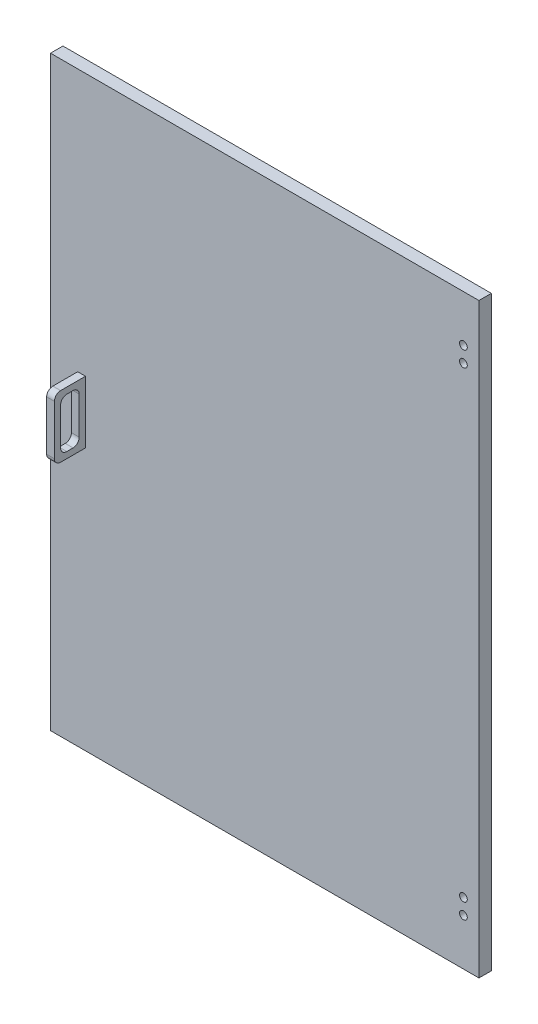
ISO-10303-21;
HEADER;
FILE_DESCRIPTION(('STEP AP214'),'2;1');
FILE_NAME('part.step','',(''),(''),'','','');
FILE_SCHEMA(('AUTOMOTIVE_DESIGN { 1 0 10303 214 1 1 1 1 }'));
ENDSEC;
DATA;
#1=APPLICATION_CONTEXT('core data for automotive mechanical design processes');
#2=APPLICATION_PROTOCOL_DEFINITION('international standard','automotive_design',2000,#1);
#3=PRODUCT_CONTEXT('',#1,'mechanical');
#4=PRODUCT('Part','Part','',(#3));
#5=PRODUCT_RELATED_PRODUCT_CATEGORY('part','',(#4));
#6=PRODUCT_DEFINITION_FORMATION('','',#4);
#7=PRODUCT_DEFINITION_CONTEXT('part definition',#1,'design');
#8=PRODUCT_DEFINITION('design','',#6,#7);
#9=PRODUCT_DEFINITION_SHAPE('','',#8);
#10=(LENGTH_UNIT() NAMED_UNIT(*) SI_UNIT(.MILLI.,.METRE.));
#11=(NAMED_UNIT(*) PLANE_ANGLE_UNIT() SI_UNIT($,.RADIAN.));
#12=(NAMED_UNIT(*) SI_UNIT($,.STERADIAN.) SOLID_ANGLE_UNIT());
#13=UNCERTAINTY_MEASURE_WITH_UNIT(LENGTH_MEASURE(1.E-05),#10,'distance_accuracy_value','');
#14=(GEOMETRIC_REPRESENTATION_CONTEXT(3) GLOBAL_UNCERTAINTY_ASSIGNED_CONTEXT((#13)) GLOBAL_UNIT_ASSIGNED_CONTEXT((#10,
#11,#12)) REPRESENTATION_CONTEXT('',''));
#15=CARTESIAN_POINT('',(0.,0.,0.));
#16=DIRECTION('',(0.,0.,1.));
#17=DIRECTION('',(1.,0.,0.));
#18=AXIS2_PLACEMENT_3D('',#15,#16,#17);
#19=CARTESIAN_POINT('',(0.,0.,0.));
#20=DIRECTION('',(0.,0.,1.));
#21=DIRECTION('',(1.,0.,0.));
#22=AXIS2_PLACEMENT_3D('',#19,#20,#21);
#23=PLANE('',#22);
#24=CARTESIAN_POINT('',(81.28,100.965,0.));
#25=DIRECTION('',(0.,0.,1.));
#26=DIRECTION('',(1.,0.,0.));
#27=AXIS2_PLACEMENT_3D('',#24,#25,#26);
#28=CIRCLE('',#27,1.5875);
#29=CARTESIAN_POINT('',(82.8675,100.965,0.));
#30=VERTEX_POINT('',#29);
#31=EDGE_CURVE('E229',#30,#30,#28,.T.);
#32=ORIENTED_EDGE('',*,*,#31,.F.);
#33=EDGE_LOOP('',(#32));
#34=FACE_BOUND('',#33,.T.);
#35=CARTESIAN_POINT('',(81.28,94.615,0.));
#36=DIRECTION('',(0.,0.,1.));
#37=DIRECTION('',(1.,0.,0.));
#38=AXIS2_PLACEMENT_3D('',#35,#36,#37);
#39=CIRCLE('',#38,1.5875);
#40=CARTESIAN_POINT('',(82.8675,94.615,0.));
#41=VERTEX_POINT('',#40);
#42=EDGE_CURVE('E233',#41,#41,#39,.T.);
#43=ORIENTED_EDGE('',*,*,#42,.F.);
#44=EDGE_LOOP('',(#43));
#45=FACE_BOUND('',#44,.T.);
#46=CARTESIAN_POINT('',(81.28,-94.615,0.));
#47=DIRECTION('',(0.,0.,1.));
#48=DIRECTION('',(-1.,0.,0.));
#49=AXIS2_PLACEMENT_3D('',#46,#47,#48);
#50=CIRCLE('',#49,1.5875);
#51=CARTESIAN_POINT('',(79.6925,-94.615,0.));
#52=VERTEX_POINT('',#51);
#53=EDGE_CURVE('E241',#52,#52,#50,.T.);
#54=ORIENTED_EDGE('',*,*,#53,.F.);
#55=EDGE_LOOP('',(#54));
#56=FACE_BOUND('',#55,.T.);
#57=CARTESIAN_POINT('',(81.28,-100.965,0.));
#58=DIRECTION('',(0.,0.,1.));
#59=DIRECTION('',(-1.,0.,0.));
#60=AXIS2_PLACEMENT_3D('',#57,#58,#59);
#61=CIRCLE('',#60,1.5875);
#62=CARTESIAN_POINT('',(79.6925,-100.965,0.));
#63=VERTEX_POINT('',#62);
#64=EDGE_CURVE('E249',#63,#63,#61,.T.);
#65=ORIENTED_EDGE('',*,*,#64,.F.);
#66=EDGE_LOOP('',(#65));
#67=FACE_BOUND('',#66,.T.);
#68=DIRECTION('',(0.,-1.,0.));
#69=VECTOR('',#68,1.);
#70=CARTESIAN_POINT('',(-87.63,120.015,0.));
#71=LINE('',#70,#69);
#72=CARTESIAN_POINT('',(-87.63,120.015,0.));
#73=VERTEX_POINT('',#72);
#74=CARTESIAN_POINT('',(-87.63,-120.015,0.));
#75=VERTEX_POINT('',#74);
#76=EDGE_CURVE('E228',#73,#75,#71,.T.);
#77=ORIENTED_EDGE('',*,*,#76,.T.);
#78=DIRECTION('',(1.,0.,0.));
#79=VECTOR('',#78,1.);
#80=CARTESIAN_POINT('',(-87.63,-120.015,0.));
#81=LINE('',#80,#79);
#82=CARTESIAN_POINT('',(87.63,-120.015,0.));
#83=VERTEX_POINT('',#82);
#84=EDGE_CURVE('E277',#75,#83,#81,.T.);
#85=ORIENTED_EDGE('',*,*,#84,.T.);
#86=DIRECTION('',(0.,1.,0.));
#87=VECTOR('',#86,1.);
#88=CARTESIAN_POINT('',(87.63,120.015,0.));
#89=LINE('',#88,#87);
#90=CARTESIAN_POINT('',(87.63,120.015,0.));
#91=VERTEX_POINT('',#90);
#92=EDGE_CURVE('E281',#83,#91,#89,.T.);
#93=ORIENTED_EDGE('',*,*,#92,.T.);
#94=DIRECTION('',(-1.,0.,0.));
#95=VECTOR('',#94,1.);
#96=CARTESIAN_POINT('',(-87.63,120.015,0.));
#97=LINE('',#96,#95);
#98=EDGE_CURVE('E261',#91,#73,#97,.T.);
#99=ORIENTED_EDGE('',*,*,#98,.T.);
#100=EDGE_LOOP('',(#77,#85,#93,#99));
#101=FACE_BOUND('',#100,.T.);
#102=DIRECTION('',(-1.,0.,0.));
#103=VECTOR('',#102,1.);
#104=CARTESIAN_POINT('',(-76.5175,12.7,0.));
#105=LINE('',#104,#103);
#106=CARTESIAN_POINT('',(-73.3425,12.7,0.));
#107=VERTEX_POINT('',#106);
#108=CARTESIAN_POINT('',(-76.5175,12.7,0.));
#109=VERTEX_POINT('',#108);
#110=EDGE_CURVE('E182',#107,#109,#105,.T.);
#111=ORIENTED_EDGE('',*,*,#110,.F.);
#112=DIRECTION('',(0.,1.,0.));
#113=VECTOR('',#112,1.);
#114=CARTESIAN_POINT('',(-73.3425,-12.7,0.));
#115=LINE('',#114,#113);
#116=CARTESIAN_POINT('',(-73.3425,-12.7,0.));
#117=VERTEX_POINT('',#116);
#118=EDGE_CURVE('E193',#117,#107,#115,.T.);
#119=ORIENTED_EDGE('',*,*,#118,.F.);
#120=DIRECTION('',(1.,0.,0.));
#121=VECTOR('',#120,1.);
#122=CARTESIAN_POINT('',(-76.5175,-12.7,0.));
#123=LINE('',#122,#121);
#124=CARTESIAN_POINT('',(-76.5175,-12.7,0.));
#125=VERTEX_POINT('',#124);
#126=EDGE_CURVE('E209',#125,#117,#123,.T.);
#127=ORIENTED_EDGE('',*,*,#126,.F.);
#128=DIRECTION('',(0.,-1.,0.));
#129=VECTOR('',#128,1.);
#130=CARTESIAN_POINT('',(-76.5175,-12.7,0.));
#131=LINE('',#130,#129);
#132=EDGE_CURVE('E205',#109,#125,#131,.T.);
#133=ORIENTED_EDGE('',*,*,#132,.F.);
#134=EDGE_LOOP('',(#111,#119,#127,#133));
#135=FACE_BOUND('',#134,.T.);
#136=ADVANCED_FACE('F51',(#34,#45,#56,#67,#101,#135),#23,.T.);
#137=CARTESIAN_POINT('',(-87.63,120.015,-5.08));
#138=DIRECTION('',(-1.,0.,0.));
#139=DIRECTION('',(0.,-1.,0.));
#140=AXIS2_PLACEMENT_3D('',#137,#138,#139);
#141=PLANE('',#140);
#142=ORIENTED_EDGE('',*,*,#76,.F.);
#143=DIRECTION('',(0.,0.,1.));
#144=VECTOR('',#143,1.);
#145=CARTESIAN_POINT('',(-87.63,120.015,-5.08));
#146=LINE('',#145,#144);
#147=CARTESIAN_POINT('',(-87.63,120.015,-5.08));
#148=VERTEX_POINT('',#147);
#149=EDGE_CURVE('E288',#148,#73,#146,.T.);
#150=ORIENTED_EDGE('',*,*,#149,.F.);
#151=DIRECTION('',(0.,-1.,0.));
#152=VECTOR('',#151,1.);
#153=CARTESIAN_POINT('',(-87.63,120.015,-5.08));
#154=LINE('',#153,#152);
#155=CARTESIAN_POINT('',(-87.63,-120.015,-5.08));
#156=VERTEX_POINT('',#155);
#157=EDGE_CURVE('E256',#148,#156,#154,.T.);
#158=ORIENTED_EDGE('',*,*,#157,.T.);
#159=DIRECTION('',(0.,0.,1.));
#160=VECTOR('',#159,1.);
#161=CARTESIAN_POINT('',(-87.63,-120.015,-5.08));
#162=LINE('',#161,#160);
#163=EDGE_CURVE('E273',#156,#75,#162,.T.);
#164=ORIENTED_EDGE('',*,*,#163,.T.);
#165=EDGE_LOOP('',(#142,#150,#158,#164));
#166=FACE_BOUND('',#165,.T.);
#167=ADVANCED_FACE('F452',(#166),#141,.T.);
#168=CARTESIAN_POINT('',(-87.63,120.015,-5.08));
#169=DIRECTION('',(0.,1.,0.));
#170=DIRECTION('',(0.,0.,1.));
#171=AXIS2_PLACEMENT_3D('',#168,#169,#170);
#172=PLANE('',#171);
#173=ORIENTED_EDGE('',*,*,#98,.F.);
#174=DIRECTION('',(0.,0.,1.));
#175=VECTOR('',#174,1.);
#176=CARTESIAN_POINT('',(87.63,120.015,-5.08));
#177=LINE('',#176,#175);
#178=CARTESIAN_POINT('',(87.63,120.015,-5.08));
#179=VERTEX_POINT('',#178);
#180=EDGE_CURVE('E292',#179,#91,#177,.T.);
#181=ORIENTED_EDGE('',*,*,#180,.F.);
#182=DIRECTION('',(-1.,0.,0.));
#183=VECTOR('',#182,1.);
#184=CARTESIAN_POINT('',(-87.63,120.015,-5.08));
#185=LINE('',#184,#183);
#186=EDGE_CURVE('E269',#179,#148,#185,.T.);
#187=ORIENTED_EDGE('',*,*,#186,.T.);
#188=ORIENTED_EDGE('',*,*,#149,.T.);
#189=EDGE_LOOP('',(#173,#181,#187,#188));
#190=FACE_BOUND('',#189,.T.);
#191=ADVANCED_FACE('F458',(#190),#172,.T.);
#192=CARTESIAN_POINT('',(87.63,120.015,-5.08));
#193=DIRECTION('',(1.,0.,0.));
#194=DIRECTION('',(0.,1.,0.));
#195=AXIS2_PLACEMENT_3D('',#192,#193,#194);
#196=PLANE('',#195);
#197=ORIENTED_EDGE('',*,*,#92,.F.);
#198=DIRECTION('',(0.,0.,1.));
#199=VECTOR('',#198,1.);
#200=CARTESIAN_POINT('',(87.63,-120.015,-5.08));
#201=LINE('',#200,#199);
#202=CARTESIAN_POINT('',(87.63,-120.015,-5.08));
#203=VERTEX_POINT('',#202);
#204=EDGE_CURVE('E295',#203,#83,#201,.T.);
#205=ORIENTED_EDGE('',*,*,#204,.F.);
#206=DIRECTION('',(0.,1.,0.));
#207=VECTOR('',#206,1.);
#208=CARTESIAN_POINT('',(87.63,120.015,-5.08));
#209=LINE('',#208,#207);
#210=EDGE_CURVE('E265',#203,#179,#209,.T.);
#211=ORIENTED_EDGE('',*,*,#210,.T.);
#212=ORIENTED_EDGE('',*,*,#180,.T.);
#213=EDGE_LOOP('',(#197,#205,#211,#212));
#214=FACE_BOUND('',#213,.T.);
#215=ADVANCED_FACE('F469',(#214),#196,.T.);
#216=CARTESIAN_POINT('',(-87.63,-120.015,-5.08));
#217=DIRECTION('',(0.,-1.,0.));
#218=DIRECTION('',(0.,0.,-1.));
#219=AXIS2_PLACEMENT_3D('',#216,#217,#218);
#220=PLANE('',#219);
#221=ORIENTED_EDGE('',*,*,#84,.F.);
#222=ORIENTED_EDGE('',*,*,#163,.F.);
#223=DIRECTION('',(1.,0.,0.));
#224=VECTOR('',#223,1.);
#225=CARTESIAN_POINT('',(-87.63,-120.015,-5.08));
#226=LINE('',#225,#224);
#227=EDGE_CURVE('E260',#156,#203,#226,.T.);
#228=ORIENTED_EDGE('',*,*,#227,.T.);
#229=ORIENTED_EDGE('',*,*,#204,.T.);
#230=EDGE_LOOP('',(#221,#222,#228,#229));
#231=FACE_BOUND('',#230,.T.);
#232=ADVANCED_FACE('F473',(#231),#220,.T.);
#233=CARTESIAN_POINT('',(0.,0.,-5.08));
#234=DIRECTION('',(0.,0.,1.));
#235=DIRECTION('',(1.,0.,0.));
#236=AXIS2_PLACEMENT_3D('',#233,#234,#235);
#237=PLANE('',#236);
#238=CARTESIAN_POINT('',(81.28,100.965,-5.08));
#239=DIRECTION('',(0.,0.,1.));
#240=DIRECTION('',(1.,0.,0.));
#241=AXIS2_PLACEMENT_3D('',#238,#239,#240);
#242=CIRCLE('',#241,1.5875);
#243=CARTESIAN_POINT('',(82.8675,100.965,-5.08));
#244=VERTEX_POINT('',#243);
#245=EDGE_CURVE('E224',#244,#244,#242,.T.);
#246=ORIENTED_EDGE('',*,*,#245,.T.);
#247=EDGE_LOOP('',(#246));
#248=FACE_BOUND('',#247,.T.);
#249=CARTESIAN_POINT('',(81.28,94.615,-5.08));
#250=DIRECTION('',(0.,0.,1.));
#251=DIRECTION('',(1.,0.,0.));
#252=AXIS2_PLACEMENT_3D('',#249,#250,#251);
#253=CIRCLE('',#252,1.5875);
#254=CARTESIAN_POINT('',(82.8675,94.615,-5.08));
#255=VERTEX_POINT('',#254);
#256=EDGE_CURVE('E237',#255,#255,#253,.T.);
#257=ORIENTED_EDGE('',*,*,#256,.T.);
#258=EDGE_LOOP('',(#257));
#259=FACE_BOUND('',#258,.T.);
#260=CARTESIAN_POINT('',(81.28,-94.615,-5.08));
#261=DIRECTION('',(0.,0.,1.));
#262=DIRECTION('',(-1.,0.,0.));
#263=AXIS2_PLACEMENT_3D('',#260,#261,#262);
#264=CIRCLE('',#263,1.5875);
#265=CARTESIAN_POINT('',(79.6925,-94.615,-5.08));
#266=VERTEX_POINT('',#265);
#267=EDGE_CURVE('E245',#266,#266,#264,.T.);
#268=ORIENTED_EDGE('',*,*,#267,.T.);
#269=EDGE_LOOP('',(#268));
#270=FACE_BOUND('',#269,.T.);
#271=CARTESIAN_POINT('',(81.28,-100.965,-5.08));
#272=DIRECTION('',(0.,0.,1.));
#273=DIRECTION('',(-1.,0.,0.));
#274=AXIS2_PLACEMENT_3D('',#271,#272,#273);
#275=CIRCLE('',#274,1.5875);
#276=CARTESIAN_POINT('',(79.6925,-100.965,-5.08));
#277=VERTEX_POINT('',#276);
#278=EDGE_CURVE('E189',#277,#277,#275,.T.);
#279=ORIENTED_EDGE('',*,*,#278,.T.);
#280=EDGE_LOOP('',(#279));
#281=FACE_BOUND('',#280,.T.);
#282=ORIENTED_EDGE('',*,*,#157,.F.);
#283=ORIENTED_EDGE('',*,*,#186,.F.);
#284=ORIENTED_EDGE('',*,*,#210,.F.);
#285=ORIENTED_EDGE('',*,*,#227,.F.);
#286=EDGE_LOOP('',(#282,#283,#284,#285));
#287=FACE_BOUND('',#286,.T.);
#288=ADVANCED_FACE('F465',(#248,#259,#270,#281,#287),#237,.F.);
#289=CARTESIAN_POINT('',(81.28,-100.965,-5.08));
#290=DIRECTION('',(0.,0.,1.));
#291=DIRECTION('',(1.,0.,0.));
#292=AXIS2_PLACEMENT_3D('',#289,#290,#291);
#293=CYLINDRICAL_SURFACE('',#292,1.5875);
#294=ORIENTED_EDGE('',*,*,#278,.F.);
#295=EDGE_LOOP('',(#294));
#296=FACE_BOUND('',#295,.T.);
#297=ORIENTED_EDGE('',*,*,#64,.T.);
#298=EDGE_LOOP('',(#297));
#299=FACE_BOUND('',#298,.T.);
#300=ADVANCED_FACE('F480',(#296,#299),#293,.F.);
#301=CARTESIAN_POINT('',(81.28,-94.615,-5.08));
#302=DIRECTION('',(0.,0.,1.));
#303=DIRECTION('',(1.,0.,0.));
#304=AXIS2_PLACEMENT_3D('',#301,#302,#303);
#305=CYLINDRICAL_SURFACE('',#304,1.5875);
#306=ORIENTED_EDGE('',*,*,#267,.F.);
#307=EDGE_LOOP('',(#306));
#308=FACE_BOUND('',#307,.T.);
#309=ORIENTED_EDGE('',*,*,#53,.T.);
#310=EDGE_LOOP('',(#309));
#311=FACE_BOUND('',#310,.T.);
#312=ADVANCED_FACE('F495',(#308,#311),#305,.F.);
#313=CARTESIAN_POINT('',(81.28,94.615,-5.08));
#314=DIRECTION('',(0.,0.,1.));
#315=DIRECTION('',(1.,0.,0.));
#316=AXIS2_PLACEMENT_3D('',#313,#314,#315);
#317=CYLINDRICAL_SURFACE('',#316,1.5875);
#318=ORIENTED_EDGE('',*,*,#256,.F.);
#319=EDGE_LOOP('',(#318));
#320=FACE_BOUND('',#319,.T.);
#321=ORIENTED_EDGE('',*,*,#42,.T.);
#322=EDGE_LOOP('',(#321));
#323=FACE_BOUND('',#322,.T.);
#324=ADVANCED_FACE('F510',(#320,#323),#317,.F.);
#325=CARTESIAN_POINT('',(81.28,100.965,-5.08));
#326=DIRECTION('',(0.,0.,1.));
#327=DIRECTION('',(1.,0.,0.));
#328=AXIS2_PLACEMENT_3D('',#325,#326,#327);
#329=CYLINDRICAL_SURFACE('',#328,1.5875);
#330=ORIENTED_EDGE('',*,*,#245,.F.);
#331=EDGE_LOOP('',(#330));
#332=FACE_BOUND('',#331,.T.);
#333=ORIENTED_EDGE('',*,*,#31,.T.);
#334=EDGE_LOOP('',(#333));
#335=FACE_BOUND('',#334,.T.);
#336=ADVANCED_FACE('F517',(#332,#335),#329,.F.);
#337=CARTESIAN_POINT('',(-73.3425,-12.7,12.7));
#338=DIRECTION('',(-1.,0.,0.));
#339=DIRECTION('',(0.,0.,1.));
#340=AXIS2_PLACEMENT_3D('',#337,#338,#339);
#341=PLANE('',#340);
#342=DIRECTION('',(0.,0.,1.));
#343=VECTOR('',#342,1.);
#344=CARTESIAN_POINT('',(-73.3425,10.16,10.16));
#345=LINE('',#344,#343);
#346=CARTESIAN_POINT('',(-73.3425,10.16,5.08));
#347=VERTEX_POINT('',#346);
#348=CARTESIAN_POINT('',(-73.3425,10.16,7.62));
#349=VERTEX_POINT('',#348);
#350=EDGE_CURVE('E389',#347,#349,#345,.T.);
#351=ORIENTED_EDGE('',*,*,#350,.F.);
#352=CARTESIAN_POINT('',(-73.3425,7.62,5.08));
#353=DIRECTION('',(-1.,0.,0.));
#354=DIRECTION('',(0.,0.,1.));
#355=AXIS2_PLACEMENT_3D('',#352,#353,#354);
#356=CIRCLE('',#355,2.54);
#357=CARTESIAN_POINT('',(-73.3425,7.62,2.54));
#358=VERTEX_POINT('',#357);
#359=EDGE_CURVE('E60',#347,#358,#356,.T.);
#360=ORIENTED_EDGE('',*,*,#359,.T.);
#361=DIRECTION('',(0.,1.,0.));
#362=VECTOR('',#361,1.);
#363=CARTESIAN_POINT('',(-73.3425,-10.16,2.54));
#364=LINE('',#363,#362);
#365=CARTESIAN_POINT('',(-73.3425,-7.62,2.54));
#366=VERTEX_POINT('',#365);
#367=EDGE_CURVE('E387',#366,#358,#364,.T.);
#368=ORIENTED_EDGE('',*,*,#367,.F.);
#369=CARTESIAN_POINT('',(-73.3425,-7.62,5.08));
#370=DIRECTION('',(-1.,0.,0.));
#371=DIRECTION('',(0.,0.,1.));
#372=AXIS2_PLACEMENT_3D('',#369,#370,#371);
#373=CIRCLE('',#372,2.54);
#374=CARTESIAN_POINT('',(-73.3425,-10.16,5.08));
#375=VERTEX_POINT('',#374);
#376=EDGE_CURVE('E371',#366,#375,#373,.T.);
#377=ORIENTED_EDGE('',*,*,#376,.T.);
#378=DIRECTION('',(0.,0.,-1.));
#379=VECTOR('',#378,1.);
#380=CARTESIAN_POINT('',(-73.3425,-10.16,10.16));
#381=LINE('',#380,#379);
#382=CARTESIAN_POINT('',(-73.3425,-10.16,7.62));
#383=VERTEX_POINT('',#382);
#384=EDGE_CURVE('E202',#383,#375,#381,.T.);
#385=ORIENTED_EDGE('',*,*,#384,.F.);
#386=CARTESIAN_POINT('',(-73.3425,-7.62,7.62));
#387=DIRECTION('',(-1.,0.,0.));
#388=DIRECTION('',(0.,0.,1.));
#389=AXIS2_PLACEMENT_3D('',#386,#387,#388);
#390=CIRCLE('',#389,2.54);
#391=CARTESIAN_POINT('',(-73.3425,-7.62,10.16));
#392=VERTEX_POINT('',#391);
#393=EDGE_CURVE('E365',#383,#392,#390,.T.);
#394=ORIENTED_EDGE('',*,*,#393,.T.);
#395=DIRECTION('',(0.,-1.,0.));
#396=VECTOR('',#395,1.);
#397=CARTESIAN_POINT('',(-73.3425,-10.16,10.16));
#398=LINE('',#397,#396);
#399=CARTESIAN_POINT('',(-73.3425,7.62,10.16));
#400=VERTEX_POINT('',#399);
#401=EDGE_CURVE('E413',#400,#392,#398,.T.);
#402=ORIENTED_EDGE('',*,*,#401,.F.);
#403=CARTESIAN_POINT('',(-73.3425,7.62,7.62));
#404=DIRECTION('',(-1.,0.,0.));
#405=DIRECTION('',(0.,0.,1.));
#406=AXIS2_PLACEMENT_3D('',#403,#404,#405);
#407=CIRCLE('',#406,2.54);
#408=EDGE_CURVE('E377',#400,#349,#407,.T.);
#409=ORIENTED_EDGE('',*,*,#408,.T.);
#410=EDGE_LOOP('',(#351,#360,#368,#377,#385,#394,#402,#409));
#411=FACE_BOUND('',#410,.T.);
#412=DIRECTION('',(0.,1.,0.));
#413=VECTOR('',#412,1.);
#414=CARTESIAN_POINT('',(-73.3425,-12.7,12.7));
#415=LINE('',#414,#413);
#416=CARTESIAN_POINT('',(-73.3425,-10.16,12.7));
#417=VERTEX_POINT('',#416);
#418=CARTESIAN_POINT('',(-73.3425,10.16,12.7));
#419=VERTEX_POINT('',#418);
#420=EDGE_CURVE('E215',#417,#419,#415,.T.);
#421=ORIENTED_EDGE('',*,*,#420,.F.);
#422=CARTESIAN_POINT('',(-73.3425,-10.16,10.16));
#423=DIRECTION('',(-1.,0.,0.));
#424=DIRECTION('',(0.,0.,1.));
#425=AXIS2_PLACEMENT_3D('',#422,#423,#424);
#426=CIRCLE('',#425,2.54);
#427=CARTESIAN_POINT('',(-73.3425,-12.7,10.16));
#428=VERTEX_POINT('',#427);
#429=EDGE_CURVE('E325',#417,#428,#426,.F.);
#430=ORIENTED_EDGE('',*,*,#429,.T.);
#431=DIRECTION('',(0.,0.,-1.));
#432=VECTOR('',#431,1.);
#433=CARTESIAN_POINT('',(-73.3425,-12.7,12.7));
#434=LINE('',#433,#432);
#435=EDGE_CURVE('E197',#428,#117,#434,.T.);
#436=ORIENTED_EDGE('',*,*,#435,.T.);
#437=ORIENTED_EDGE('',*,*,#118,.T.);
#438=DIRECTION('',(0.,0.,-1.));
#439=VECTOR('',#438,1.);
#440=CARTESIAN_POINT('',(-73.3425,12.7,12.7));
#441=LINE('',#440,#439);
#442=CARTESIAN_POINT('',(-73.3425,12.7,10.16));
#443=VERTEX_POINT('',#442);
#444=EDGE_CURVE('E178',#443,#107,#441,.T.);
#445=ORIENTED_EDGE('',*,*,#444,.F.);
#446=CARTESIAN_POINT('',(-73.3425,10.16,10.16));
#447=DIRECTION('',(-1.,0.,0.));
#448=DIRECTION('',(0.,0.,1.));
#449=AXIS2_PLACEMENT_3D('',#446,#447,#448);
#450=CIRCLE('',#449,2.54);
#451=EDGE_CURVE('E322',#443,#419,#450,.F.);
#452=ORIENTED_EDGE('',*,*,#451,.T.);
#453=EDGE_LOOP('',(#421,#430,#436,#437,#445,#452));
#454=FACE_BOUND('',#453,.T.);
#455=ADVANCED_FACE('F195',(#411,#454),#341,.F.);
#456=CARTESIAN_POINT('',(-76.5175,12.7,12.7));
#457=DIRECTION('',(0.,-1.,0.));
#458=DIRECTION('',(0.,0.,-1.));
#459=AXIS2_PLACEMENT_3D('',#456,#457,#458);
#460=PLANE('',#459);
#461=DIRECTION('',(0.,0.,-1.));
#462=VECTOR('',#461,1.);
#463=CARTESIAN_POINT('',(-76.5175,12.7,12.7));
#464=LINE('',#463,#462);
#465=CARTESIAN_POINT('',(-76.5175,12.7,10.16));
#466=VERTEX_POINT('',#465);
#467=EDGE_CURVE('E190',#466,#109,#464,.T.);
#468=ORIENTED_EDGE('',*,*,#467,.F.);
#469=DIRECTION('',(-1.,0.,0.));
#470=VECTOR('',#469,1.);
#471=CARTESIAN_POINT('',(-76.5175,12.7,10.16));
#472=LINE('',#471,#470);
#473=EDGE_CURVE('E185',#466,#443,#472,.F.);
#474=ORIENTED_EDGE('',*,*,#473,.T.);
#475=ORIENTED_EDGE('',*,*,#444,.T.);
#476=ORIENTED_EDGE('',*,*,#110,.T.);
#477=EDGE_LOOP('',(#468,#474,#475,#476));
#478=FACE_BOUND('',#477,.T.);
#479=ADVANCED_FACE('F180',(#478),#460,.F.);
#480=CARTESIAN_POINT('',(-76.5175,-12.7,12.7));
#481=DIRECTION('',(1.,0.,0.));
#482=DIRECTION('',(0.,0.,-1.));
#483=AXIS2_PLACEMENT_3D('',#480,#481,#482);
#484=PLANE('',#483);
#485=DIRECTION('',(0.,-1.,0.));
#486=VECTOR('',#485,1.);
#487=CARTESIAN_POINT('',(-76.5175,-12.7,10.16));
#488=LINE('',#487,#486);
#489=CARTESIAN_POINT('',(-76.5175,7.62,10.16));
#490=VERTEX_POINT('',#489);
#491=CARTESIAN_POINT('',(-76.5175,-7.62,10.16));
#492=VERTEX_POINT('',#491);
#493=EDGE_CURVE('E303',#490,#492,#488,.T.);
#494=ORIENTED_EDGE('',*,*,#493,.T.);
#495=CARTESIAN_POINT('',(-76.5175,-7.62,7.62));
#496=DIRECTION('',(1.,0.,0.));
#497=DIRECTION('',(0.,0.,-1.));
#498=AXIS2_PLACEMENT_3D('',#495,#496,#497);
#499=CIRCLE('',#498,2.54);
#500=CARTESIAN_POINT('',(-76.5175,-10.16,7.62));
#501=VERTEX_POINT('',#500);
#502=EDGE_CURVE('E368',#492,#501,#499,.T.);
#503=ORIENTED_EDGE('',*,*,#502,.T.);
#504=DIRECTION('',(0.,0.,-1.));
#505=VECTOR('',#504,1.);
#506=CARTESIAN_POINT('',(-76.5175,-10.16,12.7));
#507=LINE('',#506,#505);
#508=CARTESIAN_POINT('',(-76.5175,-10.16,5.08));
#509=VERTEX_POINT('',#508);
#510=EDGE_CURVE('E306',#501,#509,#507,.T.);
#511=ORIENTED_EDGE('',*,*,#510,.T.);
#512=CARTESIAN_POINT('',(-76.5175,-7.62,5.08));
#513=DIRECTION('',(1.,0.,0.));
#514=DIRECTION('',(0.,0.,-1.));
#515=AXIS2_PLACEMENT_3D('',#512,#513,#514);
#516=CIRCLE('',#515,2.54);
#517=CARTESIAN_POINT('',(-76.5175,-7.62,2.54));
#518=VERTEX_POINT('',#517);
#519=EDGE_CURVE('E374',#509,#518,#516,.T.);
#520=ORIENTED_EDGE('',*,*,#519,.T.);
#521=DIRECTION('',(0.,1.,0.));
#522=VECTOR('',#521,1.);
#523=CARTESIAN_POINT('',(-76.5175,-12.7,2.54));
#524=LINE('',#523,#522);
#525=CARTESIAN_POINT('',(-76.5175,7.62,2.54));
#526=VERTEX_POINT('',#525);
#527=EDGE_CURVE('E310',#518,#526,#524,.T.);
#528=ORIENTED_EDGE('',*,*,#527,.T.);
#529=CARTESIAN_POINT('',(-76.5175,7.62,5.08));
#530=DIRECTION('',(1.,0.,0.));
#531=DIRECTION('',(0.,0.,-1.));
#532=AXIS2_PLACEMENT_3D('',#529,#530,#531);
#533=CIRCLE('',#532,2.54);
#534=CARTESIAN_POINT('',(-76.5175,10.16,5.08));
#535=VERTEX_POINT('',#534);
#536=EDGE_CURVE('E11',#526,#535,#533,.T.);
#537=ORIENTED_EDGE('',*,*,#536,.T.);
#538=DIRECTION('',(0.,0.,1.));
#539=VECTOR('',#538,1.);
#540=CARTESIAN_POINT('',(-76.5175,10.16,12.7));
#541=LINE('',#540,#539);
#542=CARTESIAN_POINT('',(-76.5175,10.16,7.62));
#543=VERTEX_POINT('',#542);
#544=EDGE_CURVE('E291',#535,#543,#541,.T.);
#545=ORIENTED_EDGE('',*,*,#544,.T.);
#546=CARTESIAN_POINT('',(-76.5175,7.62,7.62));
#547=DIRECTION('',(1.,0.,0.));
#548=DIRECTION('',(0.,0.,-1.));
#549=AXIS2_PLACEMENT_3D('',#546,#547,#548);
#550=CIRCLE('',#549,2.54);
#551=EDGE_CURVE('E380',#543,#490,#550,.T.);
#552=ORIENTED_EDGE('',*,*,#551,.T.);
#553=EDGE_LOOP('',(#494,#503,#511,#520,#528,#537,#545,#552));
#554=FACE_BOUND('',#553,.T.);
#555=DIRECTION('',(0.,0.,-1.));
#556=VECTOR('',#555,1.);
#557=CARTESIAN_POINT('',(-76.5175,-12.7,12.7));
#558=LINE('',#557,#556);
#559=CARTESIAN_POINT('',(-76.5175,-12.7,10.16));
#560=VERTEX_POINT('',#559);
#561=EDGE_CURVE('E218',#560,#125,#558,.T.);
#562=ORIENTED_EDGE('',*,*,#561,.F.);
#563=CARTESIAN_POINT('',(-76.5175,-10.16,10.16));
#564=DIRECTION('',(1.,0.,0.));
#565=DIRECTION('',(0.,0.,-1.));
#566=AXIS2_PLACEMENT_3D('',#563,#564,#565);
#567=CIRCLE('',#566,2.54);
#568=CARTESIAN_POINT('',(-76.5175,-10.16,12.7));
#569=VERTEX_POINT('',#568);
#570=EDGE_CURVE('E333',#560,#569,#567,.F.);
#571=ORIENTED_EDGE('',*,*,#570,.T.);
#572=DIRECTION('',(0.,-1.,0.));
#573=VECTOR('',#572,1.);
#574=CARTESIAN_POINT('',(-76.5175,-12.7,12.7));
#575=LINE('',#574,#573);
#576=CARTESIAN_POINT('',(-76.5175,10.16,12.7));
#577=VERTEX_POINT('',#576);
#578=EDGE_CURVE('E219',#577,#569,#575,.T.);
#579=ORIENTED_EDGE('',*,*,#578,.F.);
#580=CARTESIAN_POINT('',(-76.5175,10.16,10.16));
#581=DIRECTION('',(1.,0.,0.));
#582=DIRECTION('',(0.,0.,-1.));
#583=AXIS2_PLACEMENT_3D('',#580,#581,#582);
#584=CIRCLE('',#583,2.54);
#585=EDGE_CURVE('E67',#577,#466,#584,.F.);
#586=ORIENTED_EDGE('',*,*,#585,.T.);
#587=ORIENTED_EDGE('',*,*,#467,.T.);
#588=ORIENTED_EDGE('',*,*,#132,.T.);
#589=EDGE_LOOP('',(#562,#571,#579,#586,#587,#588));
#590=FACE_BOUND('',#589,.T.);
#591=ADVANCED_FACE('F402',(#554,#590),#484,.F.);
#592=CARTESIAN_POINT('',(-76.5175,-12.7,12.7));
#593=DIRECTION('',(0.,1.,0.));
#594=DIRECTION('',(0.,0.,1.));
#595=AXIS2_PLACEMENT_3D('',#592,#593,#594);
#596=PLANE('',#595);
#597=ORIENTED_EDGE('',*,*,#435,.F.);
#598=DIRECTION('',(1.,0.,0.));
#599=VECTOR('',#598,1.);
#600=CARTESIAN_POINT('',(-76.5175,-12.7,10.16));
#601=LINE('',#600,#599);
#602=EDGE_CURVE('E328',#428,#560,#601,.F.);
#603=ORIENTED_EDGE('',*,*,#602,.T.);
#604=ORIENTED_EDGE('',*,*,#561,.T.);
#605=ORIENTED_EDGE('',*,*,#126,.T.);
#606=EDGE_LOOP('',(#597,#603,#604,#605));
#607=FACE_BOUND('',#606,.T.);
#608=ADVANCED_FACE('F436',(#607),#596,.F.);
#609=CARTESIAN_POINT('',(0.,0.,12.7));
#610=DIRECTION('',(0.,0.,-1.));
#611=DIRECTION('',(-1.,0.,0.));
#612=AXIS2_PLACEMENT_3D('',#609,#610,#611);
#613=PLANE('',#612);
#614=ORIENTED_EDGE('',*,*,#578,.T.);
#615=DIRECTION('',(1.,0.,0.));
#616=VECTOR('',#615,1.);
#617=CARTESIAN_POINT('',(0.,-10.16,12.7));
#618=LINE('',#617,#616);
#619=EDGE_CURVE('E318',#569,#417,#618,.T.);
#620=ORIENTED_EDGE('',*,*,#619,.T.);
#621=ORIENTED_EDGE('',*,*,#420,.T.);
#622=DIRECTION('',(-1.,0.,0.));
#623=VECTOR('',#622,1.);
#624=CARTESIAN_POINT('',(0.,10.16,12.7));
#625=LINE('',#624,#623);
#626=EDGE_CURVE('E314',#419,#577,#625,.T.);
#627=ORIENTED_EDGE('',*,*,#626,.T.);
#628=EDGE_LOOP('',(#614,#620,#621,#627));
#629=FACE_BOUND('',#628,.T.);
#630=ADVANCED_FACE('F429',(#629),#613,.F.);
#631=CARTESIAN_POINT('',(-87.63,-10.16,2.54));
#632=DIRECTION('',(0.,0.,-1.));
#633=DIRECTION('',(-1.,0.,0.));
#634=AXIS2_PLACEMENT_3D('',#631,#632,#633);
#635=PLANE('',#634);
#636=ORIENTED_EDGE('',*,*,#527,.F.);
#637=DIRECTION('',(1.,0.,0.));
#638=VECTOR('',#637,1.);
#639=CARTESIAN_POINT('',(-73.3425,-7.62,2.54));
#640=LINE('',#639,#638);
#641=EDGE_CURVE('E354',#518,#366,#640,.T.);
#642=ORIENTED_EDGE('',*,*,#641,.T.);
#643=ORIENTED_EDGE('',*,*,#367,.T.);
#644=DIRECTION('',(1.,0.,0.));
#645=VECTOR('',#644,1.);
#646=CARTESIAN_POINT('',(-76.5175,7.62,2.54));
#647=LINE('',#646,#645);
#648=EDGE_CURVE('E351',#358,#526,#647,.F.);
#649=ORIENTED_EDGE('',*,*,#648,.T.);
#650=EDGE_LOOP('',(#636,#642,#643,#649));
#651=FACE_BOUND('',#650,.T.);
#652=ADVANCED_FACE('F395',(#651),#635,.F.);
#653=CARTESIAN_POINT('',(-87.63,-10.16,10.16));
#654=DIRECTION('',(0.,-1.,0.));
#655=DIRECTION('',(0.,0.,-1.));
#656=AXIS2_PLACEMENT_3D('',#653,#654,#655);
#657=PLANE('',#656);
#658=ORIENTED_EDGE('',*,*,#510,.F.);
#659=DIRECTION('',(1.,0.,0.));
#660=VECTOR('',#659,1.);
#661=CARTESIAN_POINT('',(-73.3425,-10.16,7.62));
#662=LINE('',#661,#660);
#663=EDGE_CURVE('E341',#501,#383,#662,.T.);
#664=ORIENTED_EDGE('',*,*,#663,.T.);
#665=ORIENTED_EDGE('',*,*,#384,.T.);
#666=DIRECTION('',(1.,0.,0.));
#667=VECTOR('',#666,1.);
#668=CARTESIAN_POINT('',(-76.5175,-10.16,5.08));
#669=LINE('',#668,#667);
#670=EDGE_CURVE('E338',#375,#509,#669,.F.);
#671=ORIENTED_EDGE('',*,*,#670,.T.);
#672=EDGE_LOOP('',(#658,#664,#665,#671));
#673=FACE_BOUND('',#672,.T.);
#674=ADVANCED_FACE('F536',(#673),#657,.F.);
#675=CARTESIAN_POINT('',(-87.63,-10.16,10.16));
#676=DIRECTION('',(0.,0.,1.));
#677=DIRECTION('',(1.,0.,0.));
#678=AXIS2_PLACEMENT_3D('',#675,#676,#677);
#679=PLANE('',#678);
#680=ORIENTED_EDGE('',*,*,#401,.T.);
#681=DIRECTION('',(1.,0.,0.));
#682=VECTOR('',#681,1.);
#683=CARTESIAN_POINT('',(-76.5175,-7.62,10.16));
#684=LINE('',#683,#682);
#685=EDGE_CURVE('E75',#392,#492,#684,.F.);
#686=ORIENTED_EDGE('',*,*,#685,.T.);
#687=ORIENTED_EDGE('',*,*,#493,.F.);
#688=DIRECTION('',(1.,0.,0.));
#689=VECTOR('',#688,1.);
#690=CARTESIAN_POINT('',(-73.3425,7.62,10.16));
#691=LINE('',#690,#689);
#692=EDGE_CURVE('E345',#490,#400,#691,.T.);
#693=ORIENTED_EDGE('',*,*,#692,.T.);
#694=EDGE_LOOP('',(#680,#686,#687,#693));
#695=FACE_BOUND('',#694,.T.);
#696=ADVANCED_FACE('F411',(#695),#679,.F.);
#697=CARTESIAN_POINT('',(-87.63,10.16,10.16));
#698=DIRECTION('',(0.,1.,0.));
#699=DIRECTION('',(0.,0.,1.));
#700=AXIS2_PLACEMENT_3D('',#697,#698,#699);
#701=PLANE('',#700);
#702=ORIENTED_EDGE('',*,*,#350,.T.);
#703=DIRECTION('',(1.,0.,0.));
#704=VECTOR('',#703,1.);
#705=CARTESIAN_POINT('',(-76.5175,10.16,7.62));
#706=LINE('',#705,#704);
#707=EDGE_CURVE('E362',#349,#543,#706,.F.);
#708=ORIENTED_EDGE('',*,*,#707,.T.);
#709=ORIENTED_EDGE('',*,*,#544,.F.);
#710=DIRECTION('',(1.,0.,0.));
#711=VECTOR('',#710,1.);
#712=CARTESIAN_POINT('',(-73.3425,10.16,5.08));
#713=LINE('',#712,#711);
#714=EDGE_CURVE('E358',#535,#347,#713,.T.);
#715=ORIENTED_EDGE('',*,*,#714,.T.);
#716=EDGE_LOOP('',(#702,#708,#709,#715));
#717=FACE_BOUND('',#716,.T.);
#718=ADVANCED_FACE('F405',(#717),#701,.F.);
#719=CARTESIAN_POINT('',(0.,-10.16,10.16));
#720=DIRECTION('',(1.,0.,0.));
#721=DIRECTION('',(0.,0.,-1.));
#722=AXIS2_PLACEMENT_3D('',#719,#720,#721);
#723=CYLINDRICAL_SURFACE('',#722,2.54);
#724=ORIENTED_EDGE('',*,*,#570,.F.);
#725=ORIENTED_EDGE('',*,*,#602,.F.);
#726=ORIENTED_EDGE('',*,*,#429,.F.);
#727=ORIENTED_EDGE('',*,*,#619,.F.);
#728=EDGE_LOOP('',(#724,#725,#726,#727));
#729=FACE_BOUND('',#728,.T.);
#730=ADVANCED_FACE('F433',(#729),#723,.T.);
#731=CARTESIAN_POINT('',(0.,10.16,10.16));
#732=DIRECTION('',(-1.,0.,0.));
#733=DIRECTION('',(0.,0.,1.));
#734=AXIS2_PLACEMENT_3D('',#731,#732,#733);
#735=CYLINDRICAL_SURFACE('',#734,2.54);
#736=ORIENTED_EDGE('',*,*,#451,.F.);
#737=ORIENTED_EDGE('',*,*,#473,.F.);
#738=ORIENTED_EDGE('',*,*,#585,.F.);
#739=ORIENTED_EDGE('',*,*,#626,.F.);
#740=EDGE_LOOP('',(#736,#737,#738,#739));
#741=FACE_BOUND('',#740,.T.);
#742=ADVANCED_FACE('F439',(#741),#735,.T.);
#743=CARTESIAN_POINT('',(-87.63,-7.62,7.62));
#744=DIRECTION('',(-1.,0.,0.));
#745=DIRECTION('',(0.,0.,1.));
#746=AXIS2_PLACEMENT_3D('',#743,#744,#745);
#747=CYLINDRICAL_SURFACE('',#746,2.54);
#748=ORIENTED_EDGE('',*,*,#502,.F.);
#749=ORIENTED_EDGE('',*,*,#685,.F.);
#750=ORIENTED_EDGE('',*,*,#393,.F.);
#751=ORIENTED_EDGE('',*,*,#663,.F.);
#752=EDGE_LOOP('',(#748,#749,#750,#751));
#753=FACE_BOUND('',#752,.T.);
#754=ADVANCED_FACE('F441',(#753),#747,.F.);
#755=CARTESIAN_POINT('',(-87.63,-7.62,5.08));
#756=DIRECTION('',(-1.,0.,0.));
#757=DIRECTION('',(0.,0.,1.));
#758=AXIS2_PLACEMENT_3D('',#755,#756,#757);
#759=CYLINDRICAL_SURFACE('',#758,2.54);
#760=ORIENTED_EDGE('',*,*,#519,.F.);
#761=ORIENTED_EDGE('',*,*,#670,.F.);
#762=ORIENTED_EDGE('',*,*,#376,.F.);
#763=ORIENTED_EDGE('',*,*,#641,.F.);
#764=EDGE_LOOP('',(#760,#761,#762,#763));
#765=FACE_BOUND('',#764,.T.);
#766=ADVANCED_FACE('F447',(#765),#759,.F.);
#767=CARTESIAN_POINT('',(-87.63,7.62,7.62));
#768=DIRECTION('',(-1.,0.,0.));
#769=DIRECTION('',(0.,0.,1.));
#770=AXIS2_PLACEMENT_3D('',#767,#768,#769);
#771=CYLINDRICAL_SURFACE('',#770,2.54);
#772=ORIENTED_EDGE('',*,*,#551,.F.);
#773=ORIENTED_EDGE('',*,*,#707,.F.);
#774=ORIENTED_EDGE('',*,*,#408,.F.);
#775=ORIENTED_EDGE('',*,*,#692,.F.);
#776=EDGE_LOOP('',(#772,#773,#774,#775));
#777=FACE_BOUND('',#776,.T.);
#778=ADVANCED_FACE('F408',(#777),#771,.F.);
#779=CARTESIAN_POINT('',(-87.63,7.62,5.08));
#780=DIRECTION('',(-1.,0.,0.));
#781=DIRECTION('',(0.,0.,1.));
#782=AXIS2_PLACEMENT_3D('',#779,#780,#781);
#783=CYLINDRICAL_SURFACE('',#782,2.54);
#784=ORIENTED_EDGE('',*,*,#536,.F.);
#785=ORIENTED_EDGE('',*,*,#648,.F.);
#786=ORIENTED_EDGE('',*,*,#359,.F.);
#787=ORIENTED_EDGE('',*,*,#714,.F.);
#788=EDGE_LOOP('',(#784,#785,#786,#787));
#789=FACE_BOUND('',#788,.T.);
#790=ADVANCED_FACE('F53',(#789),#783,.F.);
#791=CLOSED_SHELL('',(#136,#167,#191,#215,#232,#288,#300,#312,#324,#336,#455,#479,#591,#608,
#630,#652,#674,#696,#718,#730,#742,#754,#766,#778,#790));
#792=MANIFOLD_SOLID_BREP('B2',#791);
#793=ADVANCED_BREP_SHAPE_REPRESENTATION('',(#18,#792),#14);
#794=SHAPE_DEFINITION_REPRESENTATION(#9,#793);
ENDSEC;
END-ISO-10303-21;
